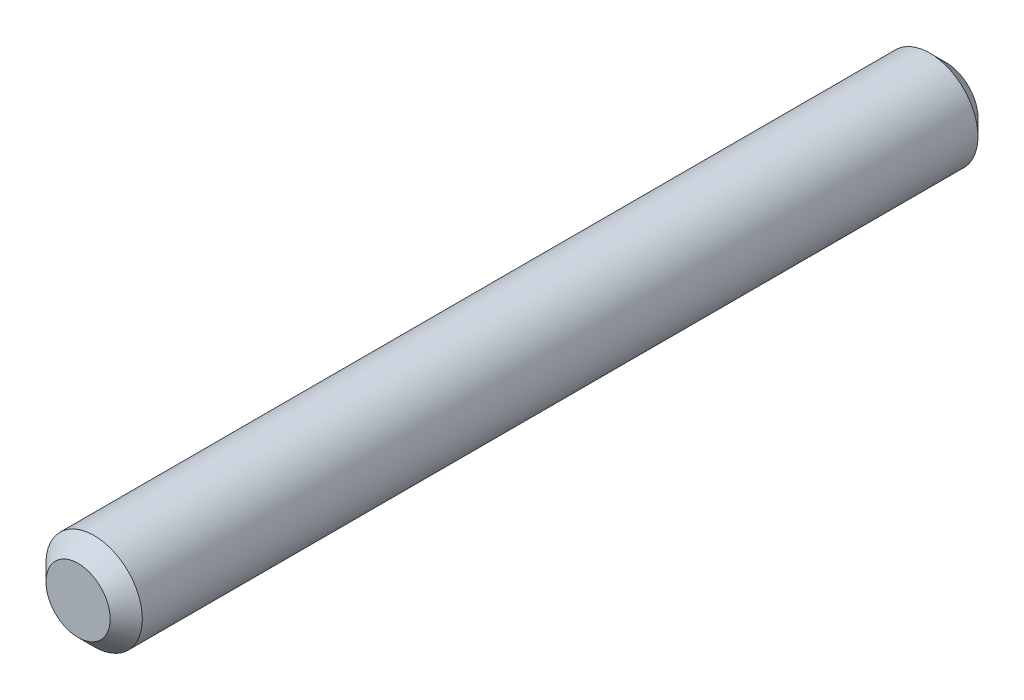
ISO-10303-21;
HEADER;
FILE_DESCRIPTION(('STEP AP214'),'2;1');
FILE_NAME('part.step','',(''),(''),'','','');
FILE_SCHEMA(('AUTOMOTIVE_DESIGN { 1 0 10303 214 1 1 1 1 }'));
ENDSEC;
DATA;
#1=APPLICATION_CONTEXT('core data for automotive mechanical design processes');
#2=APPLICATION_PROTOCOL_DEFINITION('international standard','automotive_design',2000,#1);
#3=PRODUCT_CONTEXT('',#1,'mechanical');
#4=PRODUCT('Part','Part','',(#3));
#5=PRODUCT_RELATED_PRODUCT_CATEGORY('part','',(#4));
#6=PRODUCT_DEFINITION_FORMATION('','',#4);
#7=PRODUCT_DEFINITION_CONTEXT('part definition',#1,'design');
#8=PRODUCT_DEFINITION('design','',#6,#7);
#9=PRODUCT_DEFINITION_SHAPE('','',#8);
#10=(LENGTH_UNIT() NAMED_UNIT(*) SI_UNIT(.MILLI.,.METRE.));
#11=(NAMED_UNIT(*) PLANE_ANGLE_UNIT() SI_UNIT($,.RADIAN.));
#12=(NAMED_UNIT(*) SI_UNIT($,.STERADIAN.) SOLID_ANGLE_UNIT());
#13=UNCERTAINTY_MEASURE_WITH_UNIT(LENGTH_MEASURE(1.E-05),#10,'distance_accuracy_value','');
#14=(GEOMETRIC_REPRESENTATION_CONTEXT(3) GLOBAL_UNCERTAINTY_ASSIGNED_CONTEXT((#13)) GLOBAL_UNIT_ASSIGNED_CONTEXT((#10,
#11,#12)) REPRESENTATION_CONTEXT('',''));
#15=CARTESIAN_POINT('',(0.,0.,0.));
#16=DIRECTION('',(0.,0.,1.));
#17=DIRECTION('',(1.,0.,0.));
#18=AXIS2_PLACEMENT_3D('',#15,#16,#17);
#19=CARTESIAN_POINT('',(0.,0.,54.));
#20=DIRECTION('',(0.,0.,-1.));
#21=DIRECTION('',(-1.,0.,0.));
#22=AXIS2_PLACEMENT_3D('',#19,#20,#21);
#23=CYLINDRICAL_SURFACE('',#22,3.);
#24=CARTESIAN_POINT('',(0.,0.,1.00000000000001));
#25=DIRECTION('',(0.,0.,1.));
#26=DIRECTION('',(1.,0.,0.));
#27=AXIS2_PLACEMENT_3D('',#24,#25,#26);
#28=CIRCLE('',#27,3.);
#29=CARTESIAN_POINT('',(3.,0.,1.00000000000001));
#30=VERTEX_POINT('',#29);
#31=EDGE_CURVE('E53',#30,#30,#28,.T.);
#32=ORIENTED_EDGE('',*,*,#31,.T.);
#33=EDGE_LOOP('',(#32));
#34=FACE_BOUND('',#33,.T.);
#35=CARTESIAN_POINT('',(0.,0.,53.));
#36=DIRECTION('',(0.,0.,1.));
#37=DIRECTION('',(1.,0.,0.));
#38=AXIS2_PLACEMENT_3D('',#35,#36,#37);
#39=CIRCLE('',#38,3.);
#40=CARTESIAN_POINT('',(3.,0.,53.));
#41=VERTEX_POINT('',#40);
#42=EDGE_CURVE('E58',#41,#41,#39,.F.);
#43=ORIENTED_EDGE('',*,*,#42,.T.);
#44=EDGE_LOOP('',(#43));
#45=FACE_BOUND('',#44,.T.);
#46=ADVANCED_FACE('F39',(#34,#45),#23,.T.);
#47=CARTESIAN_POINT('',(0.,0.,54.));
#48=DIRECTION('',(0.,0.,1.));
#49=DIRECTION('',(1.,0.,0.));
#50=AXIS2_PLACEMENT_3D('',#47,#48,#49);
#51=PLANE('',#50);
#52=CARTESIAN_POINT('',(0.,0.,54.));
#53=DIRECTION('',(0.,0.,1.));
#54=DIRECTION('',(1.,0.,0.));
#55=AXIS2_PLACEMENT_3D('',#52,#53,#54);
#56=CIRCLE('',#55,2.);
#57=CARTESIAN_POINT('',(2.,0.,54.));
#58=VERTEX_POINT('',#57);
#59=EDGE_CURVE('E10',#58,#58,#56,.T.);
#60=ORIENTED_EDGE('',*,*,#59,.T.);
#61=EDGE_LOOP('',(#60));
#62=FACE_BOUND('',#61,.T.);
#63=ADVANCED_FACE('F75',(#62),#51,.T.);
#64=CARTESIAN_POINT('',(0.,0.,0.));
#65=DIRECTION('',(0.,0.,1.));
#66=DIRECTION('',(1.,0.,0.));
#67=AXIS2_PLACEMENT_3D('',#64,#65,#66);
#68=PLANE('',#67);
#69=CARTESIAN_POINT('',(0.,0.,0.));
#70=DIRECTION('',(0.,0.,1.));
#71=DIRECTION('',(1.,0.,0.));
#72=AXIS2_PLACEMENT_3D('',#69,#70,#71);
#73=CIRCLE('',#72,1.99999999999999);
#74=CARTESIAN_POINT('',(1.99999999999999,0.,0.));
#75=VERTEX_POINT('',#74);
#76=EDGE_CURVE('E48',#75,#75,#73,.F.);
#77=ORIENTED_EDGE('',*,*,#76,.T.);
#78=EDGE_LOOP('',(#77));
#79=FACE_BOUND('',#78,.T.);
#80=ADVANCED_FACE('F72',(#79),#68,.F.);
#81=CARTESIAN_POINT('',(0.,0.,1.00000000000001));
#82=DIRECTION('',(0.,0.,1.));
#83=DIRECTION('',(1.,0.,0.));
#84=AXIS2_PLACEMENT_3D('',#81,#82,#83);
#85=CONICAL_SURFACE('',#84,3.,0.78539816339745);
#86=ORIENTED_EDGE('',*,*,#76,.F.);
#87=EDGE_LOOP('',(#86));
#88=FACE_BOUND('',#87,.T.);
#89=ORIENTED_EDGE('',*,*,#31,.F.);
#90=EDGE_LOOP('',(#89));
#91=FACE_BOUND('',#90,.T.);
#92=ADVANCED_FACE('F68',(#88,#91),#85,.T.);
#93=CARTESIAN_POINT('',(0.,0.,54.));
#94=DIRECTION('',(0.,0.,-1.));
#95=DIRECTION('',(-1.,0.,0.));
#96=AXIS2_PLACEMENT_3D('',#93,#94,#95);
#97=CONICAL_SURFACE('',#96,2.,0.785398163397447);
#98=ORIENTED_EDGE('',*,*,#42,.F.);
#99=EDGE_LOOP('',(#98));
#100=FACE_BOUND('',#99,.T.);
#101=ORIENTED_EDGE('',*,*,#59,.F.);
#102=EDGE_LOOP('',(#101));
#103=FACE_BOUND('',#102,.T.);
#104=ADVANCED_FACE('F42',(#100,#103),#97,.T.);
#105=CLOSED_SHELL('',(#46,#63,#80,#92,#104));
#106=MANIFOLD_SOLID_BREP('B2',#105);
#107=ADVANCED_BREP_SHAPE_REPRESENTATION('',(#18,#106),#14);
#108=SHAPE_DEFINITION_REPRESENTATION(#9,#107);
ENDSEC;
END-ISO-10303-21;
